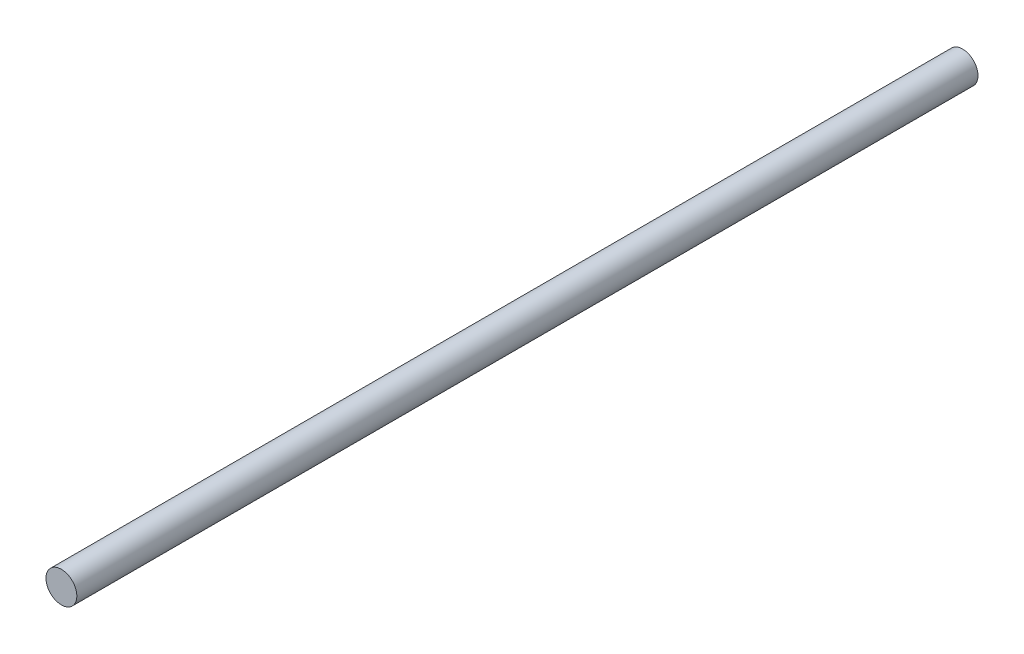
ISO-10303-21;
HEADER;
FILE_DESCRIPTION(('STEP AP214'),'2;1');
FILE_NAME('part.step','',(''),(''),'','','');
FILE_SCHEMA(('AUTOMOTIVE_DESIGN { 1 0 10303 214 1 1 1 1 }'));
ENDSEC;
DATA;
#1=APPLICATION_CONTEXT('core data for automotive mechanical design processes');
#2=APPLICATION_PROTOCOL_DEFINITION('international standard','automotive_design',2000,#1);
#3=PRODUCT_CONTEXT('',#1,'mechanical');
#4=PRODUCT('Part','Part','',(#3));
#5=PRODUCT_RELATED_PRODUCT_CATEGORY('part','',(#4));
#6=PRODUCT_DEFINITION_FORMATION('','',#4);
#7=PRODUCT_DEFINITION_CONTEXT('part definition',#1,'design');
#8=PRODUCT_DEFINITION('design','',#6,#7);
#9=PRODUCT_DEFINITION_SHAPE('','',#8);
#10=(LENGTH_UNIT() NAMED_UNIT(*) SI_UNIT(.MILLI.,.METRE.));
#11=(NAMED_UNIT(*) PLANE_ANGLE_UNIT() SI_UNIT($,.RADIAN.));
#12=(NAMED_UNIT(*) SI_UNIT($,.STERADIAN.) SOLID_ANGLE_UNIT());
#13=UNCERTAINTY_MEASURE_WITH_UNIT(LENGTH_MEASURE(1.E-05),#10,'distance_accuracy_value','');
#14=(GEOMETRIC_REPRESENTATION_CONTEXT(3) GLOBAL_UNCERTAINTY_ASSIGNED_CONTEXT((#13)) GLOBAL_UNIT_ASSIGNED_CONTEXT((#10,
#11,#12)) REPRESENTATION_CONTEXT('',''));
#15=CARTESIAN_POINT('',(0.,0.,0.));
#16=DIRECTION('',(0.,0.,1.));
#17=DIRECTION('',(1.,0.,0.));
#18=AXIS2_PLACEMENT_3D('',#15,#16,#17);
#19=CARTESIAN_POINT('',(0.,0.,292.));
#20=DIRECTION('',(0.,0.,-1.));
#21=DIRECTION('',(-1.,0.,0.));
#22=AXIS2_PLACEMENT_3D('',#19,#20,#21);
#23=CYLINDRICAL_SURFACE('',#22,5.);
#24=CARTESIAN_POINT('',(0.,0.,292.));
#25=DIRECTION('',(0.,0.,1.));
#26=DIRECTION('',(1.,0.,0.));
#27=AXIS2_PLACEMENT_3D('',#24,#25,#26);
#28=CIRCLE('',#27,5.);
#29=CARTESIAN_POINT('',(5.,0.,292.));
#30=VERTEX_POINT('',#29);
#31=EDGE_CURVE('E10',#30,#30,#28,.T.);
#32=ORIENTED_EDGE('',*,*,#31,.F.);
#33=EDGE_LOOP('',(#32));
#34=FACE_BOUND('',#33,.T.);
#35=CARTESIAN_POINT('',(0.,0.,0.));
#36=DIRECTION('',(0.,0.,1.));
#37=DIRECTION('',(1.,0.,0.));
#38=AXIS2_PLACEMENT_3D('',#35,#36,#37);
#39=CIRCLE('',#38,5.);
#40=CARTESIAN_POINT('',(5.,0.,0.));
#41=VERTEX_POINT('',#40);
#42=EDGE_CURVE('E34',#41,#41,#39,.T.);
#43=ORIENTED_EDGE('',*,*,#42,.T.);
#44=EDGE_LOOP('',(#43));
#45=FACE_BOUND('',#44,.T.);
#46=ADVANCED_FACE('F31',(#34,#45),#23,.T.);
#47=CARTESIAN_POINT('',(0.,0.,292.));
#48=DIRECTION('',(0.,0.,1.));
#49=DIRECTION('',(1.,0.,0.));
#50=AXIS2_PLACEMENT_3D('',#47,#48,#49);
#51=PLANE('',#50);
#52=ORIENTED_EDGE('',*,*,#31,.T.);
#53=EDGE_LOOP('',(#52));
#54=FACE_BOUND('',#53,.T.);
#55=ADVANCED_FACE('F46',(#54),#51,.T.);
#56=CARTESIAN_POINT('',(0.,0.,0.));
#57=DIRECTION('',(0.,0.,1.));
#58=DIRECTION('',(1.,0.,0.));
#59=AXIS2_PLACEMENT_3D('',#56,#57,#58);
#60=PLANE('',#59);
#61=ORIENTED_EDGE('',*,*,#42,.F.);
#62=EDGE_LOOP('',(#61));
#63=FACE_BOUND('',#62,.T.);
#64=ADVANCED_FACE('F44',(#63),#60,.F.);
#65=CLOSED_SHELL('',(#46,#55,#64));
#66=MANIFOLD_SOLID_BREP('B2',#65);
#67=ADVANCED_BREP_SHAPE_REPRESENTATION('',(#18,#66),#14);
#68=SHAPE_DEFINITION_REPRESENTATION(#9,#67);
ENDSEC;
END-ISO-10303-21;
